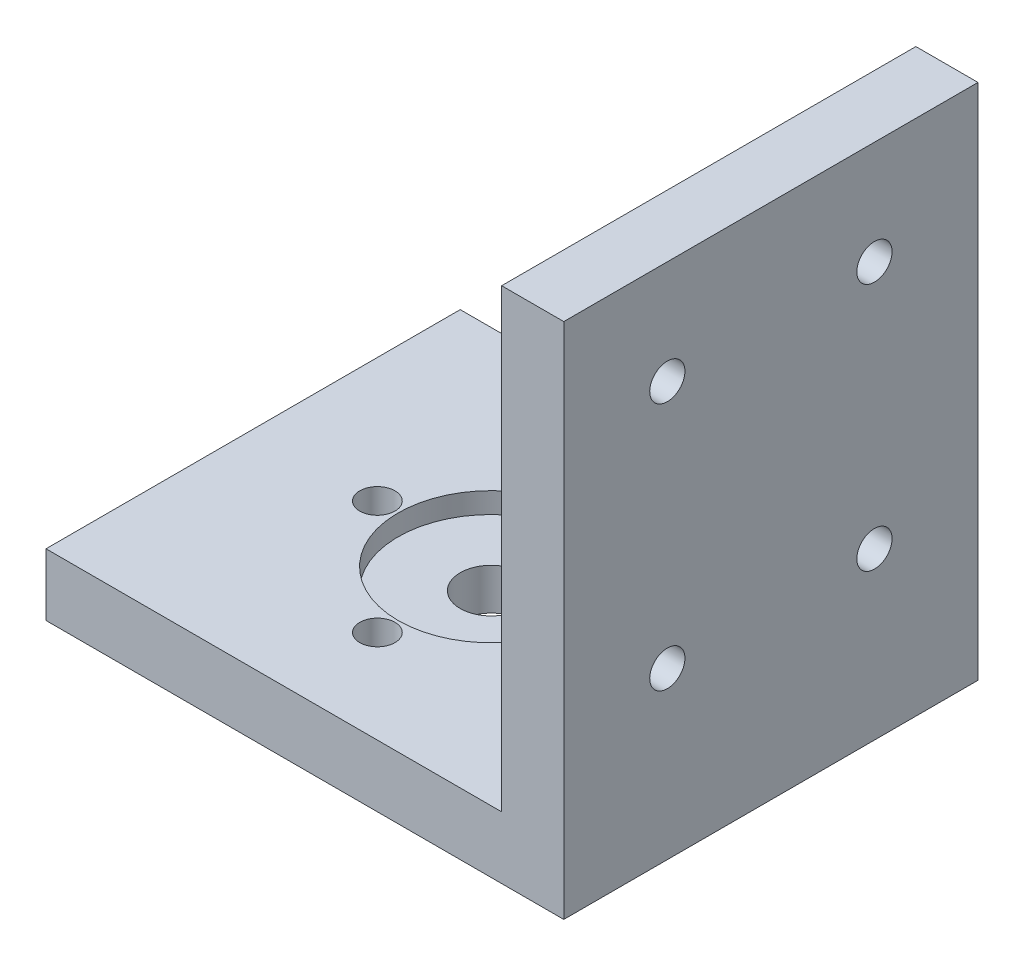
ISO-10303-21;
HEADER;
FILE_DESCRIPTION(('STEP AP214'),'2;1');
FILE_NAME('part.step','',(''),(''),'','','');
FILE_SCHEMA(('AUTOMOTIVE_DESIGN { 1 0 10303 214 1 1 1 1 }'));
ENDSEC;
DATA;
#1=APPLICATION_CONTEXT('core data for automotive mechanical design processes');
#2=APPLICATION_PROTOCOL_DEFINITION('international standard','automotive_design',2000,#1);
#3=PRODUCT_CONTEXT('',#1,'mechanical');
#4=PRODUCT('Part','Part','',(#3));
#5=PRODUCT_RELATED_PRODUCT_CATEGORY('part','',(#4));
#6=PRODUCT_DEFINITION_FORMATION('','',#4);
#7=PRODUCT_DEFINITION_CONTEXT('part definition',#1,'design');
#8=PRODUCT_DEFINITION('design','',#6,#7);
#9=PRODUCT_DEFINITION_SHAPE('','',#8);
#10=(LENGTH_UNIT() NAMED_UNIT(*) SI_UNIT(.MILLI.,.METRE.));
#11=(NAMED_UNIT(*) PLANE_ANGLE_UNIT() SI_UNIT($,.RADIAN.));
#12=(NAMED_UNIT(*) SI_UNIT($,.STERADIAN.) SOLID_ANGLE_UNIT());
#13=UNCERTAINTY_MEASURE_WITH_UNIT(LENGTH_MEASURE(1.E-05),#10,'distance_accuracy_value','');
#14=(GEOMETRIC_REPRESENTATION_CONTEXT(3) GLOBAL_UNCERTAINTY_ASSIGNED_CONTEXT((#13)) GLOBAL_UNIT_ASSIGNED_CONTEXT((#10,
#11,#12)) REPRESENTATION_CONTEXT('',''));
#15=CARTESIAN_POINT('',(0.,0.,0.));
#16=DIRECTION('',(0.,0.,1.));
#17=DIRECTION('',(1.,0.,0.));
#18=AXIS2_PLACEMENT_3D('',#15,#16,#17);
#19=CARTESIAN_POINT('',(50.,50.,0.));
#20=DIRECTION('',(-1.,0.,0.));
#21=DIRECTION('',(0.,0.,1.));
#22=AXIS2_PLACEMENT_3D('',#19,#20,#21);
#23=PLANE('',#22);
#24=CARTESIAN_POINT('',(50.,16.,-10.));
#25=DIRECTION('',(-1.,0.,0.));
#26=DIRECTION('',(0.,-1.,0.));
#27=AXIS2_PLACEMENT_3D('',#24,#25,#26);
#28=CIRCLE('',#27,1.7);
#29=CARTESIAN_POINT('',(50.,14.3,-10.));
#30=VERTEX_POINT('',#29);
#31=EDGE_CURVE('E163',#30,#30,#28,.T.);
#32=ORIENTED_EDGE('',*,*,#31,.T.);
#33=EDGE_LOOP('',(#32));
#34=FACE_BOUND('',#33,.T.);
#35=CARTESIAN_POINT('',(50.,40.,-30.));
#36=DIRECTION('',(-1.,0.,0.));
#37=DIRECTION('',(0.,-1.,0.));
#38=AXIS2_PLACEMENT_3D('',#35,#36,#37);
#39=CIRCLE('',#38,1.7);
#40=CARTESIAN_POINT('',(50.,38.3,-30.));
#41=VERTEX_POINT('',#40);
#42=EDGE_CURVE('E173',#41,#41,#39,.T.);
#43=ORIENTED_EDGE('',*,*,#42,.T.);
#44=EDGE_LOOP('',(#43));
#45=FACE_BOUND('',#44,.T.);
#46=DIRECTION('',(0.,0.,-1.));
#47=VECTOR('',#46,1.);
#48=CARTESIAN_POINT('',(50.,0.,0.));
#49=LINE('',#48,#47);
#50=CARTESIAN_POINT('',(50.,0.,0.));
#51=VERTEX_POINT('',#50);
#52=CARTESIAN_POINT('',(50.,0.,-40.));
#53=VERTEX_POINT('',#52);
#54=EDGE_CURVE('E105',#51,#53,#49,.T.);
#55=ORIENTED_EDGE('',*,*,#54,.T.);
#56=DIRECTION('',(0.,-1.,0.));
#57=VECTOR('',#56,1.);
#58=CARTESIAN_POINT('',(50.,50.,-40.));
#59=LINE('',#58,#57);
#60=CARTESIAN_POINT('',(50.,50.,-40.));
#61=VERTEX_POINT('',#60);
#62=EDGE_CURVE('E93',#61,#53,#59,.T.);
#63=ORIENTED_EDGE('',*,*,#62,.F.);
#64=DIRECTION('',(0.,0.,-1.));
#65=VECTOR('',#64,1.);
#66=CARTESIAN_POINT('',(50.,50.,0.));
#67=LINE('',#66,#65);
#68=CARTESIAN_POINT('',(50.,50.,0.));
#69=VERTEX_POINT('',#68);
#70=EDGE_CURVE('E61',#69,#61,#67,.T.);
#71=ORIENTED_EDGE('',*,*,#70,.F.);
#72=DIRECTION('',(0.,-1.,0.));
#73=VECTOR('',#72,1.);
#74=CARTESIAN_POINT('',(50.,50.,0.));
#75=LINE('',#74,#73);
#76=EDGE_CURVE('E113',#69,#51,#75,.T.);
#77=ORIENTED_EDGE('',*,*,#76,.T.);
#78=EDGE_LOOP('',(#55,#63,#71,#77));
#79=FACE_BOUND('',#78,.T.);
#80=CARTESIAN_POINT('',(50.,40.,-10.));
#81=DIRECTION('',(1.,0.,0.));
#82=DIRECTION('',(0.,1.,0.));
#83=AXIS2_PLACEMENT_3D('',#80,#81,#82);
#84=CIRCLE('',#83,1.7);
#85=CARTESIAN_POINT('',(50.,38.3,-10.));
#86=VERTEX_POINT('',#85);
#87=EDGE_CURVE('E154',#86,#86,#84,.T.);
#88=ORIENTED_EDGE('',*,*,#87,.F.);
#89=EDGE_LOOP('',(#88));
#90=FACE_BOUND('',#89,.T.);
#91=CARTESIAN_POINT('',(50.,16.,-30.));
#92=DIRECTION('',(1.,0.,0.));
#93=DIRECTION('',(0.,1.,0.));
#94=AXIS2_PLACEMENT_3D('',#91,#92,#93);
#95=CIRCLE('',#94,1.7);
#96=CARTESIAN_POINT('',(50.,14.3,-30.));
#97=VERTEX_POINT('',#96);
#98=EDGE_CURVE('E158',#97,#97,#95,.T.);
#99=ORIENTED_EDGE('',*,*,#98,.F.);
#100=EDGE_LOOP('',(#99));
#101=FACE_BOUND('',#100,.T.);
#102=ADVANCED_FACE('F39',(#34,#45,#79,#90,#101),#23,.F.);
#103=CARTESIAN_POINT('',(44.,50.,-50.));
#104=DIRECTION('',(-1.,0.,0.));
#105=DIRECTION('',(0.,-1.,0.));
#106=AXIS2_PLACEMENT_3D('',#103,#104,#105);
#107=PLANE('',#106);
#108=CARTESIAN_POINT('',(44.,40.,-10.));
#109=DIRECTION('',(1.,0.,0.));
#110=DIRECTION('',(0.,1.,0.));
#111=AXIS2_PLACEMENT_3D('',#108,#109,#110);
#112=CIRCLE('',#111,1.7);
#113=CARTESIAN_POINT('',(44.,38.3,-10.));
#114=VERTEX_POINT('',#113);
#115=EDGE_CURVE('E180',#114,#114,#112,.T.);
#116=ORIENTED_EDGE('',*,*,#115,.T.);
#117=EDGE_LOOP('',(#116));
#118=FACE_BOUND('',#117,.T.);
#119=CARTESIAN_POINT('',(44.,40.,-30.));
#120=DIRECTION('',(-1.,0.,0.));
#121=DIRECTION('',(0.,-1.,0.));
#122=AXIS2_PLACEMENT_3D('',#119,#120,#121);
#123=CIRCLE('',#122,1.7);
#124=CARTESIAN_POINT('',(44.,38.3,-30.));
#125=VERTEX_POINT('',#124);
#126=EDGE_CURVE('E174',#125,#125,#123,.T.);
#127=ORIENTED_EDGE('',*,*,#126,.F.);
#128=EDGE_LOOP('',(#127));
#129=FACE_BOUND('',#128,.T.);
#130=DIRECTION('',(0.,-1.,0.));
#131=VECTOR('',#130,1.);
#132=CARTESIAN_POINT('',(44.,50.,-40.));
#133=LINE('',#132,#131);
#134=CARTESIAN_POINT('',(44.,50.,-40.));
#135=VERTEX_POINT('',#134);
#136=CARTESIAN_POINT('',(44.,6.00000000000001,-40.));
#137=VERTEX_POINT('',#136);
#138=EDGE_CURVE('E50',#135,#137,#133,.T.);
#139=ORIENTED_EDGE('',*,*,#138,.T.);
#140=DIRECTION('',(0.,0.,1.));
#141=VECTOR('',#140,1.);
#142=CARTESIAN_POINT('',(44.,6.00000000000001,-50.));
#143=LINE('',#142,#141);
#144=CARTESIAN_POINT('',(44.,6.00000000000001,0.));
#145=VERTEX_POINT('',#144);
#146=EDGE_CURVE('E123',#137,#145,#143,.T.);
#147=ORIENTED_EDGE('',*,*,#146,.T.);
#148=DIRECTION('',(0.,-1.,0.));
#149=VECTOR('',#148,1.);
#150=CARTESIAN_POINT('',(44.,50.,0.));
#151=LINE('',#150,#149);
#152=CARTESIAN_POINT('',(44.,50.,0.));
#153=VERTEX_POINT('',#152);
#154=EDGE_CURVE('E132',#153,#145,#151,.T.);
#155=ORIENTED_EDGE('',*,*,#154,.F.);
#156=DIRECTION('',(0.,0.,1.));
#157=VECTOR('',#156,1.);
#158=CARTESIAN_POINT('',(44.,50.,-50.));
#159=LINE('',#158,#157);
#160=EDGE_CURVE('E53',#135,#153,#159,.T.);
#161=ORIENTED_EDGE('',*,*,#160,.F.);
#162=EDGE_LOOP('',(#139,#147,#155,#161));
#163=FACE_BOUND('',#162,.T.);
#164=CARTESIAN_POINT('',(44.,16.,-10.));
#165=DIRECTION('',(-1.,0.,0.));
#166=DIRECTION('',(0.,-1.,0.));
#167=AXIS2_PLACEMENT_3D('',#164,#165,#166);
#168=CIRCLE('',#167,1.7);
#169=CARTESIAN_POINT('',(44.,14.3,-10.));
#170=VERTEX_POINT('',#169);
#171=EDGE_CURVE('E184',#170,#170,#168,.T.);
#172=ORIENTED_EDGE('',*,*,#171,.F.);
#173=EDGE_LOOP('',(#172));
#174=FACE_BOUND('',#173,.T.);
#175=CARTESIAN_POINT('',(44.,16.,-30.));
#176=DIRECTION('',(1.,0.,0.));
#177=DIRECTION('',(0.,1.,0.));
#178=AXIS2_PLACEMENT_3D('',#175,#176,#177);
#179=CIRCLE('',#178,1.7);
#180=CARTESIAN_POINT('',(44.,14.3,-30.));
#181=VERTEX_POINT('',#180);
#182=EDGE_CURVE('E159',#181,#181,#179,.T.);
#183=ORIENTED_EDGE('',*,*,#182,.T.);
#184=EDGE_LOOP('',(#183));
#185=FACE_BOUND('',#184,.T.);
#186=ADVANCED_FACE('F125',(#118,#129,#163,#174,#185),#107,.T.);
#187=CARTESIAN_POINT('',(0.,50.,0.));
#188=DIRECTION('',(1.,0.,0.));
#189=DIRECTION('',(0.,0.,-1.));
#190=AXIS2_PLACEMENT_3D('',#187,#188,#189);
#191=PLANE('',#190);
#192=DIRECTION('',(0.,0.,1.));
#193=VECTOR('',#192,1.);
#194=CARTESIAN_POINT('',(0.,6.00000000000001,-50.));
#195=LINE('',#194,#193);
#196=CARTESIAN_POINT('',(0.,6.00000000000001,-40.));
#197=VERTEX_POINT('',#196);
#198=CARTESIAN_POINT('',(0.,6.00000000000001,0.));
#199=VERTEX_POINT('',#198);
#200=EDGE_CURVE('E90',#197,#199,#195,.T.);
#201=ORIENTED_EDGE('',*,*,#200,.F.);
#202=DIRECTION('',(0.,-1.,0.));
#203=VECTOR('',#202,1.);
#204=CARTESIAN_POINT('',(0.,50.,-40.));
#205=LINE('',#204,#203);
#206=CARTESIAN_POINT('',(0.,0.,-40.));
#207=VERTEX_POINT('',#206);
#208=EDGE_CURVE('E84',#197,#207,#205,.T.);
#209=ORIENTED_EDGE('',*,*,#208,.T.);
#210=DIRECTION('',(0.,0.,1.));
#211=VECTOR('',#210,1.);
#212=CARTESIAN_POINT('',(0.,0.,0.));
#213=LINE('',#212,#211);
#214=CARTESIAN_POINT('',(0.,0.,0.));
#215=VERTEX_POINT('',#214);
#216=EDGE_CURVE('E87',#207,#215,#213,.T.);
#217=ORIENTED_EDGE('',*,*,#216,.T.);
#218=DIRECTION('',(0.,-1.,0.));
#219=VECTOR('',#218,1.);
#220=CARTESIAN_POINT('',(0.,50.,0.));
#221=LINE('',#220,#219);
#222=EDGE_CURVE('E116',#199,#215,#221,.T.);
#223=ORIENTED_EDGE('',*,*,#222,.F.);
#224=EDGE_LOOP('',(#201,#209,#217,#223));
#225=FACE_BOUND('',#224,.T.);
#226=ADVANCED_FACE('F41',(#225),#191,.F.);
#227=CARTESIAN_POINT('',(0.,50.,0.));
#228=DIRECTION('',(0.,0.,-1.));
#229=DIRECTION('',(-1.,0.,0.));
#230=AXIS2_PLACEMENT_3D('',#227,#228,#229);
#231=PLANE('',#230);
#232=DIRECTION('',(1.,0.,0.));
#233=VECTOR('',#232,1.);
#234=CARTESIAN_POINT('',(0.,6.00000000000001,0.));
#235=LINE('',#234,#233);
#236=EDGE_CURVE('E131',#199,#145,#235,.T.);
#237=ORIENTED_EDGE('',*,*,#236,.F.);
#238=ORIENTED_EDGE('',*,*,#222,.T.);
#239=DIRECTION('',(1.,0.,0.));
#240=VECTOR('',#239,1.);
#241=CARTESIAN_POINT('',(0.,0.,0.));
#242=LINE('',#241,#240);
#243=EDGE_CURVE('E106',#215,#51,#242,.T.);
#244=ORIENTED_EDGE('',*,*,#243,.T.);
#245=ORIENTED_EDGE('',*,*,#76,.F.);
#246=DIRECTION('',(1.,0.,0.));
#247=VECTOR('',#246,1.);
#248=CARTESIAN_POINT('',(0.,50.,0.));
#249=LINE('',#248,#247);
#250=EDGE_CURVE('E101',#153,#69,#249,.T.);
#251=ORIENTED_EDGE('',*,*,#250,.F.);
#252=ORIENTED_EDGE('',*,*,#154,.T.);
#253=EDGE_LOOP('',(#237,#238,#244,#245,#251,#252));
#254=FACE_BOUND('',#253,.T.);
#255=ADVANCED_FACE('F148',(#254),#231,.F.);
#256=CARTESIAN_POINT('',(0.,50.,-40.));
#257=DIRECTION('',(0.,0.,1.));
#258=DIRECTION('',(1.,0.,0.));
#259=AXIS2_PLACEMENT_3D('',#256,#257,#258);
#260=PLANE('',#259);
#261=ORIENTED_EDGE('',*,*,#208,.F.);
#262=DIRECTION('',(1.,0.,0.));
#263=VECTOR('',#262,1.);
#264=CARTESIAN_POINT('',(0.,6.00000000000001,-40.));
#265=LINE('',#264,#263);
#266=EDGE_CURVE('E11',#197,#137,#265,.T.);
#267=ORIENTED_EDGE('',*,*,#266,.T.);
#268=ORIENTED_EDGE('',*,*,#138,.F.);
#269=DIRECTION('',(-1.,0.,0.));
#270=VECTOR('',#269,1.);
#271=CARTESIAN_POINT('',(0.,50.,-40.));
#272=LINE('',#271,#270);
#273=EDGE_CURVE('E95',#61,#135,#272,.T.);
#274=ORIENTED_EDGE('',*,*,#273,.F.);
#275=ORIENTED_EDGE('',*,*,#62,.T.);
#276=DIRECTION('',(-1.,0.,0.));
#277=VECTOR('',#276,1.);
#278=CARTESIAN_POINT('',(0.,0.,-40.));
#279=LINE('',#278,#277);
#280=EDGE_CURVE('E96',#53,#207,#279,.T.);
#281=ORIENTED_EDGE('',*,*,#280,.T.);
#282=EDGE_LOOP('',(#261,#267,#268,#274,#275,#281));
#283=FACE_BOUND('',#282,.T.);
#284=ADVANCED_FACE('F100',(#283),#260,.F.);
#285=CARTESIAN_POINT('',(0.,50.,0.));
#286=DIRECTION('',(0.,-1.,0.));
#287=DIRECTION('',(0.,0.,-1.));
#288=AXIS2_PLACEMENT_3D('',#285,#286,#287);
#289=PLANE('',#288);
#290=ORIENTED_EDGE('',*,*,#273,.T.);
#291=ORIENTED_EDGE('',*,*,#160,.T.);
#292=ORIENTED_EDGE('',*,*,#250,.T.);
#293=ORIENTED_EDGE('',*,*,#70,.T.);
#294=EDGE_LOOP('',(#290,#291,#292,#293));
#295=FACE_BOUND('',#294,.T.);
#296=ADVANCED_FACE('F138',(#295),#289,.F.);
#297=CARTESIAN_POINT('',(0.,0.,0.));
#298=DIRECTION('',(0.,-1.,0.));
#299=DIRECTION('',(0.,0.,-1.));
#300=AXIS2_PLACEMENT_3D('',#297,#298,#299);
#301=PLANE('',#300);
#302=CARTESIAN_POINT('',(34.,0.,-20.));
#303=DIRECTION('',(0.,1.,0.));
#304=DIRECTION('',(0.,0.,1.));
#305=AXIS2_PLACEMENT_3D('',#302,#303,#304);
#306=CIRCLE('',#305,1.7);
#307=CARTESIAN_POINT('',(34.,0.,-18.3));
#308=VERTEX_POINT('',#307);
#309=EDGE_CURVE('E371',#308,#308,#306,.T.);
#310=ORIENTED_EDGE('',*,*,#309,.T.);
#311=EDGE_LOOP('',(#310));
#312=FACE_BOUND('',#311,.T.);
#313=CARTESIAN_POINT('',(23.,0.,-31.));
#314=DIRECTION('',(0.,1.,0.));
#315=DIRECTION('',(0.,0.,1.));
#316=AXIS2_PLACEMENT_3D('',#313,#314,#315);
#317=CIRCLE('',#316,1.7);
#318=CARTESIAN_POINT('',(23.,0.,-29.3));
#319=VERTEX_POINT('',#318);
#320=EDGE_CURVE('E379',#319,#319,#317,.T.);
#321=ORIENTED_EDGE('',*,*,#320,.T.);
#322=EDGE_LOOP('',(#321));
#323=FACE_BOUND('',#322,.T.);
#324=CARTESIAN_POINT('',(12.,0.,-20.));
#325=DIRECTION('',(0.,1.,0.));
#326=DIRECTION('',(0.,0.,1.));
#327=AXIS2_PLACEMENT_3D('',#324,#325,#326);
#328=CIRCLE('',#327,1.7);
#329=CARTESIAN_POINT('',(12.,0.,-18.3));
#330=VERTEX_POINT('',#329);
#331=EDGE_CURVE('E389',#330,#330,#328,.T.);
#332=ORIENTED_EDGE('',*,*,#331,.T.);
#333=EDGE_LOOP('',(#332));
#334=FACE_BOUND('',#333,.T.);
#335=CARTESIAN_POINT('',(23.,0.,-9.00000000000001));
#336=DIRECTION('',(0.,1.,0.));
#337=DIRECTION('',(0.,0.,1.));
#338=AXIS2_PLACEMENT_3D('',#335,#336,#337);
#339=CIRCLE('',#338,1.7);
#340=CARTESIAN_POINT('',(23.,0.,-7.30000000000001));
#341=VERTEX_POINT('',#340);
#342=EDGE_CURVE('E394',#341,#341,#339,.T.);
#343=ORIENTED_EDGE('',*,*,#342,.T.);
#344=EDGE_LOOP('',(#343));
#345=FACE_BOUND('',#344,.T.);
#346=CARTESIAN_POINT('',(23.,0.,-20.));
#347=DIRECTION('',(0.,1.,0.));
#348=DIRECTION('',(0.,0.,1.));
#349=AXIS2_PLACEMENT_3D('',#346,#347,#348);
#350=CIRCLE('',#349,3.);
#351=CARTESIAN_POINT('',(23.,0.,-17.));
#352=VERTEX_POINT('',#351);
#353=EDGE_CURVE('E400',#352,#352,#350,.T.);
#354=ORIENTED_EDGE('',*,*,#353,.T.);
#355=EDGE_LOOP('',(#354));
#356=FACE_BOUND('',#355,.T.);
#357=ORIENTED_EDGE('',*,*,#216,.F.);
#358=ORIENTED_EDGE('',*,*,#280,.F.);
#359=ORIENTED_EDGE('',*,*,#54,.F.);
#360=ORIENTED_EDGE('',*,*,#243,.F.);
#361=EDGE_LOOP('',(#357,#358,#359,#360));
#362=FACE_BOUND('',#361,.T.);
#363=ADVANCED_FACE('F104',(#312,#323,#334,#345,#356,#362),#301,.T.);
#364=CARTESIAN_POINT('',(0.,6.00000000000001,-50.));
#365=DIRECTION('',(0.,-1.,0.));
#366=DIRECTION('',(0.,0.,-1.));
#367=AXIS2_PLACEMENT_3D('',#364,#365,#366);
#368=PLANE('',#367);
#369=CARTESIAN_POINT('',(34.,6.00000000000001,-20.));
#370=DIRECTION('',(0.,1.,0.));
#371=DIRECTION('',(0.,0.,1.));
#372=AXIS2_PLACEMENT_3D('',#369,#370,#371);
#373=CIRCLE('',#372,1.7);
#374=CARTESIAN_POINT('',(34.,6.00000000000001,-18.3));
#375=VERTEX_POINT('',#374);
#376=EDGE_CURVE('E372',#375,#375,#373,.T.);
#377=ORIENTED_EDGE('',*,*,#376,.F.);
#378=EDGE_LOOP('',(#377));
#379=FACE_BOUND('',#378,.T.);
#380=CARTESIAN_POINT('',(23.,6.00000000000001,-31.));
#381=DIRECTION('',(0.,1.,0.));
#382=DIRECTION('',(0.,0.,1.));
#383=AXIS2_PLACEMENT_3D('',#380,#381,#382);
#384=CIRCLE('',#383,1.7);
#385=CARTESIAN_POINT('',(23.,6.00000000000001,-29.3));
#386=VERTEX_POINT('',#385);
#387=EDGE_CURVE('E374',#386,#386,#384,.T.);
#388=ORIENTED_EDGE('',*,*,#387,.F.);
#389=EDGE_LOOP('',(#388));
#390=FACE_BOUND('',#389,.T.);
#391=CARTESIAN_POINT('',(12.,6.00000000000001,-20.));
#392=DIRECTION('',(0.,1.,0.));
#393=DIRECTION('',(0.,0.,1.));
#394=AXIS2_PLACEMENT_3D('',#391,#392,#393);
#395=CIRCLE('',#394,1.7);
#396=CARTESIAN_POINT('',(12.,6.00000000000001,-18.3));
#397=VERTEX_POINT('',#396);
#398=EDGE_CURVE('E384',#397,#397,#395,.T.);
#399=ORIENTED_EDGE('',*,*,#398,.F.);
#400=EDGE_LOOP('',(#399));
#401=FACE_BOUND('',#400,.T.);
#402=CARTESIAN_POINT('',(23.,6.00000000000001,-9.00000000000001));
#403=DIRECTION('',(0.,1.,0.));
#404=DIRECTION('',(0.,0.,1.));
#405=AXIS2_PLACEMENT_3D('',#402,#403,#404);
#406=CIRCLE('',#405,1.7);
#407=CARTESIAN_POINT('',(23.,6.00000000000001,-7.30000000000001));
#408=VERTEX_POINT('',#407);
#409=EDGE_CURVE('E393',#408,#408,#406,.T.);
#410=ORIENTED_EDGE('',*,*,#409,.F.);
#411=EDGE_LOOP('',(#410));
#412=FACE_BOUND('',#411,.T.);
#413=CARTESIAN_POINT('',(23.,6.00000000000001,-20.));
#414=DIRECTION('',(0.,1.,0.));
#415=DIRECTION('',(0.,0.,1.));
#416=AXIS2_PLACEMENT_3D('',#413,#414,#415);
#417=CIRCLE('',#416,9.);
#418=CARTESIAN_POINT('',(23.,6.00000000000001,-11.));
#419=VERTEX_POINT('',#418);
#420=EDGE_CURVE('E170',#419,#419,#417,.T.);
#421=ORIENTED_EDGE('',*,*,#420,.F.);
#422=EDGE_LOOP('',(#421));
#423=FACE_BOUND('',#422,.T.);
#424=ORIENTED_EDGE('',*,*,#200,.T.);
#425=ORIENTED_EDGE('',*,*,#236,.T.);
#426=ORIENTED_EDGE('',*,*,#146,.F.);
#427=ORIENTED_EDGE('',*,*,#266,.F.);
#428=EDGE_LOOP('',(#424,#425,#426,#427));
#429=FACE_BOUND('',#428,.T.);
#430=ADVANCED_FACE('F133',(#379,#390,#401,#412,#423,#429),#368,.F.);
#431=CARTESIAN_POINT('',(50.,40.,-30.));
#432=DIRECTION('',(-1.,0.,0.));
#433=DIRECTION('',(0.,-1.,0.));
#434=AXIS2_PLACEMENT_3D('',#431,#432,#433);
#435=CYLINDRICAL_SURFACE('',#434,1.7);
#436=CARTESIAN_POINT('',(50.,38.3,-30.));
#437=CARTESIAN_POINT('',(49.9375,38.3,-30.));
#438=CARTESIAN_POINT('',(49.875,38.3,-30.));
#439=CARTESIAN_POINT('',(49.75,38.3,-30.));
#440=CARTESIAN_POINT('',(49.6875,38.3,-30.));
#441=CARTESIAN_POINT('',(49.5625,38.3,-30.));
#442=CARTESIAN_POINT('',(49.5,38.3,-30.));
#443=CARTESIAN_POINT('',(49.375,38.3,-30.));
#444=CARTESIAN_POINT('',(49.3125,38.3,-30.));
#445=CARTESIAN_POINT('',(49.1875,38.3,-30.));
#446=CARTESIAN_POINT('',(49.125,38.3,-30.));
#447=CARTESIAN_POINT('',(49.,38.3,-30.));
#448=CARTESIAN_POINT('',(48.9375,38.3,-30.));
#449=CARTESIAN_POINT('',(48.8125,38.3,-30.));
#450=CARTESIAN_POINT('',(48.75,38.3,-30.));
#451=CARTESIAN_POINT('',(48.625,38.3,-30.));
#452=CARTESIAN_POINT('',(48.5625,38.3,-30.));
#453=CARTESIAN_POINT('',(48.4375,38.3,-30.));
#454=CARTESIAN_POINT('',(48.375,38.3,-30.));
#455=CARTESIAN_POINT('',(48.25,38.3,-30.));
#456=CARTESIAN_POINT('',(48.1875,38.3,-30.));
#457=CARTESIAN_POINT('',(48.0625,38.3,-30.));
#458=CARTESIAN_POINT('',(48.,38.3,-30.));
#459=CARTESIAN_POINT('',(47.875,38.3,-30.));
#460=CARTESIAN_POINT('',(47.8125,38.3,-30.));
#461=CARTESIAN_POINT('',(47.6875,38.3,-30.));
#462=CARTESIAN_POINT('',(47.625,38.3,-30.));
#463=CARTESIAN_POINT('',(47.5,38.3,-30.));
#464=CARTESIAN_POINT('',(47.4375,38.3,-30.));
#465=CARTESIAN_POINT('',(47.3125,38.3,-30.));
#466=CARTESIAN_POINT('',(47.25,38.3,-30.));
#467=CARTESIAN_POINT('',(47.125,38.3,-30.));
#468=CARTESIAN_POINT('',(47.0625,38.3,-30.));
#469=CARTESIAN_POINT('',(46.9375,38.3,-30.));
#470=CARTESIAN_POINT('',(46.875,38.3,-30.));
#471=CARTESIAN_POINT('',(46.75,38.3,-30.));
#472=CARTESIAN_POINT('',(46.6875,38.3,-30.));
#473=CARTESIAN_POINT('',(46.5625,38.3,-30.));
#474=CARTESIAN_POINT('',(46.5,38.3,-30.));
#475=CARTESIAN_POINT('',(46.375,38.3,-30.));
#476=CARTESIAN_POINT('',(46.3125,38.3,-30.));
#477=CARTESIAN_POINT('',(46.1875,38.3,-30.));
#478=CARTESIAN_POINT('',(46.125,38.3,-30.));
#479=CARTESIAN_POINT('',(46.,38.3,-30.));
#480=CARTESIAN_POINT('',(45.9375,38.3,-30.));
#481=CARTESIAN_POINT('',(45.8125,38.3,-30.));
#482=CARTESIAN_POINT('',(45.75,38.3,-30.));
#483=CARTESIAN_POINT('',(45.625,38.3,-30.));
#484=CARTESIAN_POINT('',(45.5625,38.3,-30.));
#485=CARTESIAN_POINT('',(45.4375,38.3,-30.));
#486=CARTESIAN_POINT('',(45.375,38.3,-30.));
#487=CARTESIAN_POINT('',(45.25,38.3,-30.));
#488=CARTESIAN_POINT('',(45.1875,38.3,-30.));
#489=CARTESIAN_POINT('',(45.0625,38.3,-30.));
#490=CARTESIAN_POINT('',(45.,38.3,-30.));
#491=CARTESIAN_POINT('',(44.875,38.3,-30.));
#492=CARTESIAN_POINT('',(44.8125,38.3,-30.));
#493=CARTESIAN_POINT('',(44.6875,38.3,-30.));
#494=CARTESIAN_POINT('',(44.625,38.3,-30.));
#495=CARTESIAN_POINT('',(44.5,38.3,-30.));
#496=CARTESIAN_POINT('',(44.4375,38.3,-30.));
#497=CARTESIAN_POINT('',(44.3125,38.3,-30.));
#498=CARTESIAN_POINT('',(44.25,38.3,-30.));
#499=CARTESIAN_POINT('',(44.125,38.3,-30.));
#500=CARTESIAN_POINT('',(44.0625,38.3,-30.));
#501=CARTESIAN_POINT('',(44.,38.3,-30.));
#502=B_SPLINE_CURVE_WITH_KNOTS('',3,(#436,#437,#438,#439,#440,#441,#442,#443,#444,#445,#446,
#447,#448,#449,#450,#451,#452,#453,#454,#455,#456,#457,#458,#459,#460,#461,#462,#463,#464,#465,
#466,#467,#468,#469,#470,#471,#472,#473,#474,#475,#476,#477,#478,#479,#480,#481,#482,#483,#484,
#485,#486,#487,#488,#489,#490,#491,#492,#493,#494,#495,#496,#497,#498,#499,#500,#501),
.UNSPECIFIED.,.F.,.F.,(4,2,2,2,2,2,2,2,2,2,2,2,2,2,2,2,2,2,2,2,2,2,2,2,2,2,2,2,2,2,2,2,4),(0.,
0.187499999999993,0.374999999999993,0.562499999999994,0.749999999999994,0.937499999999994,
1.12499999999999,1.31249999999999,1.49999999999999,1.68749999999999,1.87499999999999,
2.06249999999999,2.25,2.4375,2.625,2.8125,3.,3.1875,3.375,3.5625,3.75,3.9375,4.125,4.3125,4.5,
4.6875,4.875,5.0625,5.25,5.4375,5.625,5.8125,6.),.UNSPECIFIED.);
#503=EDGE_CURVE('BSEAM216',#41,#125,#502,.T.);
#504=ORIENTED_EDGE('',*,*,#42,.F.);
#505=ORIENTED_EDGE('',*,*,#126,.T.);
#506=ORIENTED_EDGE('',*,*,#503,.T.);
#507=ORIENTED_EDGE('',*,*,#503,.F.);
#508=EDGE_LOOP('',(#504,#506,#505,#507));
#509=FACE_BOUND('',#508,.T.);
#510=ADVANCED_FACE('F216',(#509),#435,.F.);
#511=CARTESIAN_POINT('',(50.,40.,-10.));
#512=DIRECTION('',(-1.,0.,0.));
#513=DIRECTION('',(0.,-1.,0.));
#514=AXIS2_PLACEMENT_3D('',#511,#512,#513);
#515=CYLINDRICAL_SURFACE('',#514,1.7);
#516=CARTESIAN_POINT('',(50.,38.3,-10.));
#517=CARTESIAN_POINT('',(49.9375,38.3,-10.));
#518=CARTESIAN_POINT('',(49.875,38.3,-10.));
#519=CARTESIAN_POINT('',(49.75,38.3,-10.));
#520=CARTESIAN_POINT('',(49.6875,38.3,-10.));
#521=CARTESIAN_POINT('',(49.5625,38.3,-10.));
#522=CARTESIAN_POINT('',(49.5,38.3,-10.));
#523=CARTESIAN_POINT('',(49.375,38.3,-10.));
#524=CARTESIAN_POINT('',(49.3125,38.3,-10.));
#525=CARTESIAN_POINT('',(49.1875,38.3,-10.));
#526=CARTESIAN_POINT('',(49.125,38.3,-10.));
#527=CARTESIAN_POINT('',(49.,38.3,-10.));
#528=CARTESIAN_POINT('',(48.9375,38.3,-10.));
#529=CARTESIAN_POINT('',(48.8125,38.3,-10.));
#530=CARTESIAN_POINT('',(48.75,38.3,-10.));
#531=CARTESIAN_POINT('',(48.625,38.3,-10.));
#532=CARTESIAN_POINT('',(48.5625,38.3,-10.));
#533=CARTESIAN_POINT('',(48.4375,38.3,-10.));
#534=CARTESIAN_POINT('',(48.375,38.3,-10.));
#535=CARTESIAN_POINT('',(48.25,38.3,-10.));
#536=CARTESIAN_POINT('',(48.1875,38.3,-10.));
#537=CARTESIAN_POINT('',(48.0625,38.3,-10.));
#538=CARTESIAN_POINT('',(48.,38.3,-10.));
#539=CARTESIAN_POINT('',(47.875,38.3,-10.));
#540=CARTESIAN_POINT('',(47.8125,38.3,-10.));
#541=CARTESIAN_POINT('',(47.6875,38.3,-10.));
#542=CARTESIAN_POINT('',(47.625,38.3,-10.));
#543=CARTESIAN_POINT('',(47.5,38.3,-10.));
#544=CARTESIAN_POINT('',(47.4375,38.3,-10.));
#545=CARTESIAN_POINT('',(47.3125,38.3,-10.));
#546=CARTESIAN_POINT('',(47.25,38.3,-10.));
#547=CARTESIAN_POINT('',(47.125,38.3,-10.));
#548=CARTESIAN_POINT('',(47.0625,38.3,-10.));
#549=CARTESIAN_POINT('',(46.9375,38.3,-10.));
#550=CARTESIAN_POINT('',(46.875,38.3,-10.));
#551=CARTESIAN_POINT('',(46.75,38.3,-10.));
#552=CARTESIAN_POINT('',(46.6875,38.3,-10.));
#553=CARTESIAN_POINT('',(46.5625,38.3,-10.));
#554=CARTESIAN_POINT('',(46.5,38.3,-10.));
#555=CARTESIAN_POINT('',(46.375,38.3,-10.));
#556=CARTESIAN_POINT('',(46.3125,38.3,-10.));
#557=CARTESIAN_POINT('',(46.1875,38.3,-10.));
#558=CARTESIAN_POINT('',(46.125,38.3,-10.));
#559=CARTESIAN_POINT('',(46.,38.3,-10.));
#560=CARTESIAN_POINT('',(45.9375,38.3,-10.));
#561=CARTESIAN_POINT('',(45.8125,38.3,-10.));
#562=CARTESIAN_POINT('',(45.75,38.3,-10.));
#563=CARTESIAN_POINT('',(45.625,38.3,-10.));
#564=CARTESIAN_POINT('',(45.5625,38.3,-10.));
#565=CARTESIAN_POINT('',(45.4375,38.3,-10.));
#566=CARTESIAN_POINT('',(45.375,38.3,-10.));
#567=CARTESIAN_POINT('',(45.25,38.3,-10.));
#568=CARTESIAN_POINT('',(45.1875,38.3,-10.));
#569=CARTESIAN_POINT('',(45.0625,38.3,-10.));
#570=CARTESIAN_POINT('',(45.,38.3,-10.));
#571=CARTESIAN_POINT('',(44.875,38.3,-10.));
#572=CARTESIAN_POINT('',(44.8125,38.3,-10.));
#573=CARTESIAN_POINT('',(44.6875,38.3,-10.));
#574=CARTESIAN_POINT('',(44.625,38.3,-10.));
#575=CARTESIAN_POINT('',(44.5,38.3,-10.));
#576=CARTESIAN_POINT('',(44.4375,38.3,-10.));
#577=CARTESIAN_POINT('',(44.3125,38.3,-10.));
#578=CARTESIAN_POINT('',(44.25,38.3,-10.));
#579=CARTESIAN_POINT('',(44.125,38.3,-10.));
#580=CARTESIAN_POINT('',(44.0625,38.3,-10.));
#581=CARTESIAN_POINT('',(44.,38.3,-10.));
#582=B_SPLINE_CURVE_WITH_KNOTS('',3,(#516,#517,#518,#519,#520,#521,#522,#523,#524,#525,#526,
#527,#528,#529,#530,#531,#532,#533,#534,#535,#536,#537,#538,#539,#540,#541,#542,#543,#544,#545,
#546,#547,#548,#549,#550,#551,#552,#553,#554,#555,#556,#557,#558,#559,#560,#561,#562,#563,#564,
#565,#566,#567,#568,#569,#570,#571,#572,#573,#574,#575,#576,#577,#578,#579,#580,#581),
.UNSPECIFIED.,.F.,.F.,(4,2,2,2,2,2,2,2,2,2,2,2,2,2,2,2,2,2,2,2,2,2,2,2,2,2,2,2,2,2,2,2,4),(0.,
0.187499999999993,0.374999999999993,0.562499999999994,0.749999999999994,0.937499999999994,
1.12499999999999,1.31249999999999,1.49999999999999,1.68749999999999,1.87499999999999,
2.06249999999999,2.25,2.4375,2.625,2.8125,3.,3.1875,3.375,3.5625,3.75,3.9375,4.125,4.3125,4.5,
4.6875,4.875,5.0625,5.25,5.4375,5.625,5.8125,6.),.UNSPECIFIED.);
#583=EDGE_CURVE('BSEAM197',#86,#114,#582,.T.);
#584=ORIENTED_EDGE('',*,*,#87,.T.);
#585=ORIENTED_EDGE('',*,*,#115,.F.);
#586=ORIENTED_EDGE('',*,*,#583,.T.);
#587=ORIENTED_EDGE('',*,*,#583,.F.);
#588=EDGE_LOOP('',(#584,#586,#585,#587));
#589=FACE_BOUND('',#588,.T.);
#590=ADVANCED_FACE('F197',(#589),#515,.F.);
#591=CARTESIAN_POINT('',(50.,16.,-10.));
#592=DIRECTION('',(-1.,0.,0.));
#593=DIRECTION('',(0.,-1.,0.));
#594=AXIS2_PLACEMENT_3D('',#591,#592,#593);
#595=CYLINDRICAL_SURFACE('',#594,1.7);
#596=CARTESIAN_POINT('',(50.,14.3,-10.));
#597=CARTESIAN_POINT('',(49.9375,14.3,-10.));
#598=CARTESIAN_POINT('',(49.875,14.3,-10.));
#599=CARTESIAN_POINT('',(49.75,14.3,-10.));
#600=CARTESIAN_POINT('',(49.6875,14.3,-10.));
#601=CARTESIAN_POINT('',(49.5625,14.3,-10.));
#602=CARTESIAN_POINT('',(49.5,14.3,-10.));
#603=CARTESIAN_POINT('',(49.375,14.3,-10.));
#604=CARTESIAN_POINT('',(49.3125,14.3,-10.));
#605=CARTESIAN_POINT('',(49.1875,14.3,-10.));
#606=CARTESIAN_POINT('',(49.125,14.3,-10.));
#607=CARTESIAN_POINT('',(49.,14.3,-10.));
#608=CARTESIAN_POINT('',(48.9375,14.3,-10.));
#609=CARTESIAN_POINT('',(48.8125,14.3,-10.));
#610=CARTESIAN_POINT('',(48.75,14.3,-10.));
#611=CARTESIAN_POINT('',(48.625,14.3,-10.));
#612=CARTESIAN_POINT('',(48.5625,14.3,-10.));
#613=CARTESIAN_POINT('',(48.4375,14.3,-10.));
#614=CARTESIAN_POINT('',(48.375,14.3,-10.));
#615=CARTESIAN_POINT('',(48.25,14.3,-10.));
#616=CARTESIAN_POINT('',(48.1875,14.3,-10.));
#617=CARTESIAN_POINT('',(48.0625,14.3,-10.));
#618=CARTESIAN_POINT('',(48.,14.3,-10.));
#619=CARTESIAN_POINT('',(47.875,14.3,-10.));
#620=CARTESIAN_POINT('',(47.8125,14.3,-10.));
#621=CARTESIAN_POINT('',(47.6875,14.3,-10.));
#622=CARTESIAN_POINT('',(47.625,14.3,-10.));
#623=CARTESIAN_POINT('',(47.5,14.3,-10.));
#624=CARTESIAN_POINT('',(47.4375,14.3,-10.));
#625=CARTESIAN_POINT('',(47.3125,14.3,-10.));
#626=CARTESIAN_POINT('',(47.25,14.3,-10.));
#627=CARTESIAN_POINT('',(47.125,14.3,-10.));
#628=CARTESIAN_POINT('',(47.0625,14.3,-10.));
#629=CARTESIAN_POINT('',(46.9375,14.3,-10.));
#630=CARTESIAN_POINT('',(46.875,14.3,-10.));
#631=CARTESIAN_POINT('',(46.75,14.3,-10.));
#632=CARTESIAN_POINT('',(46.6875,14.3,-10.));
#633=CARTESIAN_POINT('',(46.5625,14.3,-10.));
#634=CARTESIAN_POINT('',(46.5,14.3,-10.));
#635=CARTESIAN_POINT('',(46.375,14.3,-10.));
#636=CARTESIAN_POINT('',(46.3125,14.3,-10.));
#637=CARTESIAN_POINT('',(46.1875,14.3,-10.));
#638=CARTESIAN_POINT('',(46.125,14.3,-10.));
#639=CARTESIAN_POINT('',(46.,14.3,-10.));
#640=CARTESIAN_POINT('',(45.9375,14.3,-10.));
#641=CARTESIAN_POINT('',(45.8125,14.3,-10.));
#642=CARTESIAN_POINT('',(45.75,14.3,-10.));
#643=CARTESIAN_POINT('',(45.625,14.3,-10.));
#644=CARTESIAN_POINT('',(45.5625,14.3,-10.));
#645=CARTESIAN_POINT('',(45.4375,14.3,-10.));
#646=CARTESIAN_POINT('',(45.375,14.3,-10.));
#647=CARTESIAN_POINT('',(45.25,14.3,-10.));
#648=CARTESIAN_POINT('',(45.1875,14.3,-10.));
#649=CARTESIAN_POINT('',(45.0625,14.3,-10.));
#650=CARTESIAN_POINT('',(45.,14.3,-10.));
#651=CARTESIAN_POINT('',(44.875,14.3,-10.));
#652=CARTESIAN_POINT('',(44.8125,14.3,-10.));
#653=CARTESIAN_POINT('',(44.6875,14.3,-10.));
#654=CARTESIAN_POINT('',(44.625,14.3,-10.));
#655=CARTESIAN_POINT('',(44.5,14.3,-10.));
#656=CARTESIAN_POINT('',(44.4375,14.3,-10.));
#657=CARTESIAN_POINT('',(44.3125,14.3,-10.));
#658=CARTESIAN_POINT('',(44.25,14.3,-10.));
#659=CARTESIAN_POINT('',(44.125,14.3,-10.));
#660=CARTESIAN_POINT('',(44.0625,14.3,-10.));
#661=CARTESIAN_POINT('',(44.,14.3,-10.));
#662=B_SPLINE_CURVE_WITH_KNOTS('',3,(#596,#597,#598,#599,#600,#601,#602,#603,#604,#605,#606,
#607,#608,#609,#610,#611,#612,#613,#614,#615,#616,#617,#618,#619,#620,#621,#622,#623,#624,#625,
#626,#627,#628,#629,#630,#631,#632,#633,#634,#635,#636,#637,#638,#639,#640,#641,#642,#643,#644,
#645,#646,#647,#648,#649,#650,#651,#652,#653,#654,#655,#656,#657,#658,#659,#660,#661),
.UNSPECIFIED.,.F.,.F.,(4,2,2,2,2,2,2,2,2,2,2,2,2,2,2,2,2,2,2,2,2,2,2,2,2,2,2,2,2,2,2,2,4),(0.,
0.1875,0.375,0.5625,0.750000000000001,0.937500000000001,1.125,1.3125,1.5,1.6875,1.875,2.0625,
2.25,2.4375,2.625,2.8125,3.,3.1875,3.375,3.5625,3.75,3.9375,4.125,4.3125,4.5,4.6875,4.875,
5.0625,5.25,5.4375,5.62500000000001,5.81250000000001,6.00000000000001),.UNSPECIFIED.);
#663=EDGE_CURVE('BSEAM194',#30,#170,#662,.T.);
#664=ORIENTED_EDGE('',*,*,#31,.F.);
#665=ORIENTED_EDGE('',*,*,#171,.T.);
#666=ORIENTED_EDGE('',*,*,#663,.T.);
#667=ORIENTED_EDGE('',*,*,#663,.F.);
#668=EDGE_LOOP('',(#664,#666,#665,#667));
#669=FACE_BOUND('',#668,.T.);
#670=ADVANCED_FACE('F194',(#669),#595,.F.);
#671=CARTESIAN_POINT('',(50.,16.,-30.));
#672=DIRECTION('',(-1.,0.,0.));
#673=DIRECTION('',(0.,-1.,0.));
#674=AXIS2_PLACEMENT_3D('',#671,#672,#673);
#675=CYLINDRICAL_SURFACE('',#674,1.7);
#676=CARTESIAN_POINT('',(50.,14.3,-30.));
#677=CARTESIAN_POINT('',(49.9375,14.3,-30.));
#678=CARTESIAN_POINT('',(49.875,14.3,-30.));
#679=CARTESIAN_POINT('',(49.75,14.3,-30.));
#680=CARTESIAN_POINT('',(49.6875,14.3,-30.));
#681=CARTESIAN_POINT('',(49.5625,14.3,-30.));
#682=CARTESIAN_POINT('',(49.5,14.3,-30.));
#683=CARTESIAN_POINT('',(49.375,14.3,-30.));
#684=CARTESIAN_POINT('',(49.3125,14.3,-30.));
#685=CARTESIAN_POINT('',(49.1875,14.3,-30.));
#686=CARTESIAN_POINT('',(49.125,14.3,-30.));
#687=CARTESIAN_POINT('',(49.,14.3,-30.));
#688=CARTESIAN_POINT('',(48.9375,14.3,-30.));
#689=CARTESIAN_POINT('',(48.8125,14.3,-30.));
#690=CARTESIAN_POINT('',(48.75,14.3,-30.));
#691=CARTESIAN_POINT('',(48.625,14.3,-30.));
#692=CARTESIAN_POINT('',(48.5625,14.3,-30.));
#693=CARTESIAN_POINT('',(48.4375,14.3,-30.));
#694=CARTESIAN_POINT('',(48.375,14.3,-30.));
#695=CARTESIAN_POINT('',(48.25,14.3,-30.));
#696=CARTESIAN_POINT('',(48.1875,14.3,-30.));
#697=CARTESIAN_POINT('',(48.0625,14.3,-30.));
#698=CARTESIAN_POINT('',(48.,14.3,-30.));
#699=CARTESIAN_POINT('',(47.875,14.3,-30.));
#700=CARTESIAN_POINT('',(47.8125,14.3,-30.));
#701=CARTESIAN_POINT('',(47.6875,14.3,-30.));
#702=CARTESIAN_POINT('',(47.625,14.3,-30.));
#703=CARTESIAN_POINT('',(47.5,14.3,-30.));
#704=CARTESIAN_POINT('',(47.4375,14.3,-30.));
#705=CARTESIAN_POINT('',(47.3125,14.3,-30.));
#706=CARTESIAN_POINT('',(47.25,14.3,-30.));
#707=CARTESIAN_POINT('',(47.125,14.3,-30.));
#708=CARTESIAN_POINT('',(47.0625,14.3,-30.));
#709=CARTESIAN_POINT('',(46.9375,14.3,-30.));
#710=CARTESIAN_POINT('',(46.875,14.3,-30.));
#711=CARTESIAN_POINT('',(46.75,14.3,-30.));
#712=CARTESIAN_POINT('',(46.6875,14.3,-30.));
#713=CARTESIAN_POINT('',(46.5625,14.3,-30.));
#714=CARTESIAN_POINT('',(46.5,14.3,-30.));
#715=CARTESIAN_POINT('',(46.375,14.3,-30.));
#716=CARTESIAN_POINT('',(46.3125,14.3,-30.));
#717=CARTESIAN_POINT('',(46.1875,14.3,-30.));
#718=CARTESIAN_POINT('',(46.125,14.3,-30.));
#719=CARTESIAN_POINT('',(46.,14.3,-30.));
#720=CARTESIAN_POINT('',(45.9375,14.3,-30.));
#721=CARTESIAN_POINT('',(45.8125,14.3,-30.));
#722=CARTESIAN_POINT('',(45.75,14.3,-30.));
#723=CARTESIAN_POINT('',(45.625,14.3,-30.));
#724=CARTESIAN_POINT('',(45.5625,14.3,-30.));
#725=CARTESIAN_POINT('',(45.4375,14.3,-30.));
#726=CARTESIAN_POINT('',(45.375,14.3,-30.));
#727=CARTESIAN_POINT('',(45.25,14.3,-30.));
#728=CARTESIAN_POINT('',(45.1875,14.3,-30.));
#729=CARTESIAN_POINT('',(45.0625,14.3,-30.));
#730=CARTESIAN_POINT('',(45.,14.3,-30.));
#731=CARTESIAN_POINT('',(44.875,14.3,-30.));
#732=CARTESIAN_POINT('',(44.8125,14.3,-30.));
#733=CARTESIAN_POINT('',(44.6875,14.3,-30.));
#734=CARTESIAN_POINT('',(44.625,14.3,-30.));
#735=CARTESIAN_POINT('',(44.5,14.3,-30.));
#736=CARTESIAN_POINT('',(44.4375,14.3,-30.));
#737=CARTESIAN_POINT('',(44.3125,14.3,-30.));
#738=CARTESIAN_POINT('',(44.25,14.3,-30.));
#739=CARTESIAN_POINT('',(44.125,14.3,-30.));
#740=CARTESIAN_POINT('',(44.0625,14.3,-30.));
#741=CARTESIAN_POINT('',(44.,14.3,-30.));
#742=B_SPLINE_CURVE_WITH_KNOTS('',3,(#676,#677,#678,#679,#680,#681,#682,#683,#684,#685,#686,
#687,#688,#689,#690,#691,#692,#693,#694,#695,#696,#697,#698,#699,#700,#701,#702,#703,#704,#705,
#706,#707,#708,#709,#710,#711,#712,#713,#714,#715,#716,#717,#718,#719,#720,#721,#722,#723,#724,
#725,#726,#727,#728,#729,#730,#731,#732,#733,#734,#735,#736,#737,#738,#739,#740,#741),
.UNSPECIFIED.,.F.,.F.,(4,2,2,2,2,2,2,2,2,2,2,2,2,2,2,2,2,2,2,2,2,2,2,2,2,2,2,2,2,2,2,2,4),(0.,
0.1875,0.375,0.5625,0.750000000000001,0.937500000000001,1.125,1.3125,1.5,1.6875,1.875,2.0625,
2.25,2.4375,2.625,2.8125,3.,3.1875,3.375,3.5625,3.75,3.9375,4.125,4.3125,4.5,4.6875,4.875,
5.0625,5.25,5.4375,5.62500000000001,5.81250000000001,6.00000000000001),.UNSPECIFIED.);
#743=EDGE_CURVE('BSEAM198',#97,#181,#742,.T.);
#744=ORIENTED_EDGE('',*,*,#98,.T.);
#745=ORIENTED_EDGE('',*,*,#182,.F.);
#746=ORIENTED_EDGE('',*,*,#743,.T.);
#747=ORIENTED_EDGE('',*,*,#743,.F.);
#748=EDGE_LOOP('',(#744,#746,#745,#747));
#749=FACE_BOUND('',#748,.T.);
#750=ADVANCED_FACE('F198',(#749),#675,.F.);
#751=CARTESIAN_POINT('',(23.,4.00000000000001,-20.));
#752=DIRECTION('',(0.,1.,0.));
#753=DIRECTION('',(0.,0.,1.));
#754=AXIS2_PLACEMENT_3D('',#751,#752,#753);
#755=CYLINDRICAL_SURFACE('',#754,9.);
#756=CARTESIAN_POINT('',(23.,4.00000000000001,-20.));
#757=DIRECTION('',(0.,1.,0.));
#758=DIRECTION('',(0.,0.,1.));
#759=AXIS2_PLACEMENT_3D('',#756,#757,#758);
#760=CIRCLE('',#759,9.);
#761=CARTESIAN_POINT('',(23.,4.00000000000001,-11.));
#762=VERTEX_POINT('',#761);
#763=EDGE_CURVE('E161',#762,#762,#760,.T.);
#764=ORIENTED_EDGE('',*,*,#763,.F.);
#765=EDGE_LOOP('',(#764));
#766=FACE_BOUND('',#765,.T.);
#767=ORIENTED_EDGE('',*,*,#420,.T.);
#768=EDGE_LOOP('',(#767));
#769=FACE_BOUND('',#768,.T.);
#770=ADVANCED_FACE('F206',(#766,#769),#755,.F.);
#771=CARTESIAN_POINT('',(23.,4.00000000000001,-20.));
#772=DIRECTION('',(0.,1.,0.));
#773=DIRECTION('',(0.,0.,1.));
#774=AXIS2_PLACEMENT_3D('',#771,#772,#773);
#775=PLANE('',#774);
#776=CARTESIAN_POINT('',(23.,4.00000000000001,-20.));
#777=DIRECTION('',(0.,1.,0.));
#778=DIRECTION('',(0.,0.,1.));
#779=AXIS2_PLACEMENT_3D('',#776,#777,#778);
#780=CIRCLE('',#779,3.);
#781=CARTESIAN_POINT('',(23.,4.00000000000001,-17.));
#782=VERTEX_POINT('',#781);
#783=EDGE_CURVE('E380',#782,#782,#780,.T.);
#784=ORIENTED_EDGE('',*,*,#783,.F.);
#785=EDGE_LOOP('',(#784));
#786=FACE_BOUND('',#785,.T.);
#787=ORIENTED_EDGE('',*,*,#763,.T.);
#788=EDGE_LOOP('',(#787));
#789=FACE_BOUND('',#788,.T.);
#790=ADVANCED_FACE('F211',(#786,#789),#775,.T.);
#791=CARTESIAN_POINT('',(23.,0.,-20.));
#792=DIRECTION('',(0.,1.,0.));
#793=DIRECTION('',(0.,0.,1.));
#794=AXIS2_PLACEMENT_3D('',#791,#792,#793);
#795=CYLINDRICAL_SURFACE('',#794,3.);
#796=ORIENTED_EDGE('',*,*,#353,.F.);
#797=EDGE_LOOP('',(#796));
#798=FACE_BOUND('',#797,.T.);
#799=ORIENTED_EDGE('',*,*,#783,.T.);
#800=EDGE_LOOP('',(#799));
#801=FACE_BOUND('',#800,.T.);
#802=ADVANCED_FACE('F289',(#798,#801),#795,.F.);
#803=CARTESIAN_POINT('',(23.,0.,-9.00000000000001));
#804=DIRECTION('',(0.,1.,0.));
#805=DIRECTION('',(0.,0.,1.));
#806=AXIS2_PLACEMENT_3D('',#803,#804,#805);
#807=CYLINDRICAL_SURFACE('',#806,1.7);
#808=ORIENTED_EDGE('',*,*,#342,.F.);
#809=EDGE_LOOP('',(#808));
#810=FACE_BOUND('',#809,.T.);
#811=ORIENTED_EDGE('',*,*,#409,.T.);
#812=EDGE_LOOP('',(#811));
#813=FACE_BOUND('',#812,.T.);
#814=ADVANCED_FACE('F300',(#810,#813),#807,.F.);
#815=CARTESIAN_POINT('',(12.,0.,-20.));
#816=DIRECTION('',(0.,1.,0.));
#817=DIRECTION('',(0.,0.,1.));
#818=AXIS2_PLACEMENT_3D('',#815,#816,#817);
#819=CYLINDRICAL_SURFACE('',#818,1.7);
#820=ORIENTED_EDGE('',*,*,#331,.F.);
#821=EDGE_LOOP('',(#820));
#822=FACE_BOUND('',#821,.T.);
#823=ORIENTED_EDGE('',*,*,#398,.T.);
#824=EDGE_LOOP('',(#823));
#825=FACE_BOUND('',#824,.T.);
#826=ADVANCED_FACE('F308',(#822,#825),#819,.F.);
#827=CARTESIAN_POINT('',(23.,0.,-31.));
#828=DIRECTION('',(0.,1.,0.));
#829=DIRECTION('',(0.,0.,1.));
#830=AXIS2_PLACEMENT_3D('',#827,#828,#829);
#831=CYLINDRICAL_SURFACE('',#830,1.7);
#832=ORIENTED_EDGE('',*,*,#320,.F.);
#833=EDGE_LOOP('',(#832));
#834=FACE_BOUND('',#833,.T.);
#835=ORIENTED_EDGE('',*,*,#387,.T.);
#836=EDGE_LOOP('',(#835));
#837=FACE_BOUND('',#836,.T.);
#838=ADVANCED_FACE('F312',(#834,#837),#831,.F.);
#839=CARTESIAN_POINT('',(34.,0.,-20.));
#840=DIRECTION('',(0.,1.,0.));
#841=DIRECTION('',(0.,0.,1.));
#842=AXIS2_PLACEMENT_3D('',#839,#840,#841);
#843=CYLINDRICAL_SURFACE('',#842,1.7);
#844=ORIENTED_EDGE('',*,*,#309,.F.);
#845=EDGE_LOOP('',(#844));
#846=FACE_BOUND('',#845,.T.);
#847=ORIENTED_EDGE('',*,*,#376,.T.);
#848=EDGE_LOOP('',(#847));
#849=FACE_BOUND('',#848,.T.);
#850=ADVANCED_FACE('F322',(#846,#849),#843,.F.);
#851=CLOSED_SHELL('',(#102,#186,#226,#255,#284,#296,#363,#430,#510,#590,#670,#750,#770,#790,
#802,#814,#826,#838,#850));
#852=MANIFOLD_SOLID_BREP('B2',#851);
#853=ADVANCED_BREP_SHAPE_REPRESENTATION('',(#18,#852),#14);
#854=SHAPE_DEFINITION_REPRESENTATION(#9,#853);
ENDSEC;
END-ISO-10303-21;
